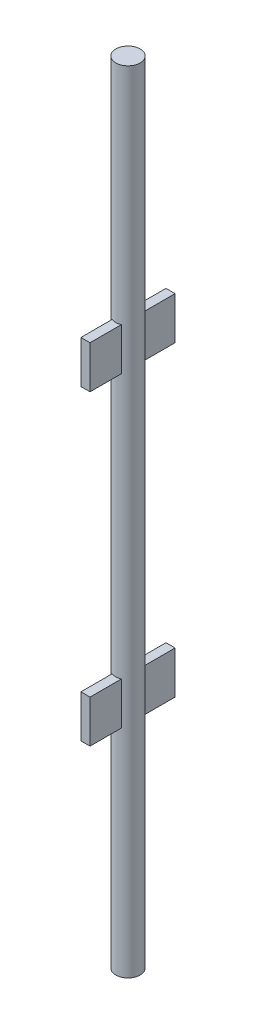
ISO-10303-21;
HEADER;
FILE_DESCRIPTION(('STEP AP214'),'2;1');
FILE_NAME('part.step','',(''),(''),'','','');
FILE_SCHEMA(('AUTOMOTIVE_DESIGN { 1 0 10303 214 1 1 1 1 }'));
ENDSEC;
DATA;
#1=APPLICATION_CONTEXT('core data for automotive mechanical design processes');
#2=APPLICATION_PROTOCOL_DEFINITION('international standard','automotive_design',2000,#1);
#3=PRODUCT_CONTEXT('',#1,'mechanical');
#4=PRODUCT('Part','Part','',(#3));
#5=PRODUCT_RELATED_PRODUCT_CATEGORY('part','',(#4));
#6=PRODUCT_DEFINITION_FORMATION('','',#4);
#7=PRODUCT_DEFINITION_CONTEXT('part definition',#1,'design');
#8=PRODUCT_DEFINITION('design','',#6,#7);
#9=PRODUCT_DEFINITION_SHAPE('','',#8);
#10=(LENGTH_UNIT() NAMED_UNIT(*) SI_UNIT(.MILLI.,.METRE.));
#11=(NAMED_UNIT(*) PLANE_ANGLE_UNIT() SI_UNIT($,.RADIAN.));
#12=(NAMED_UNIT(*) SI_UNIT($,.STERADIAN.) SOLID_ANGLE_UNIT());
#13=UNCERTAINTY_MEASURE_WITH_UNIT(LENGTH_MEASURE(1.E-05),#10,'distance_accuracy_value','');
#14=(GEOMETRIC_REPRESENTATION_CONTEXT(3) GLOBAL_UNCERTAINTY_ASSIGNED_CONTEXT((#13)) GLOBAL_UNIT_ASSIGNED_CONTEXT((#10,
#11,#12)) REPRESENTATION_CONTEXT('',''));
#15=CARTESIAN_POINT('',(0.,0.,0.));
#16=DIRECTION('',(0.,0.,1.));
#17=DIRECTION('',(1.,0.,0.));
#18=AXIS2_PLACEMENT_3D('',#15,#16,#17);
#19=CARTESIAN_POINT('',(0.,1300.,0.));
#20=DIRECTION('',(0.,-1.,0.));
#21=DIRECTION('',(0.,0.,-1.));
#22=AXIS2_PLACEMENT_3D('',#19,#20,#21);
#23=CYLINDRICAL_SURFACE('',#22,20.);
#24=DIRECTION('',(0.,-1.,0.));
#25=VECTOR('',#24,1.);
#26=CARTESIAN_POINT('',(-7.49999999999995,1300.,-18.5404962177392));
#27=LINE('',#26,#25);
#28=CARTESIAN_POINT('',(-7.49999999999995,860.,-18.5404962177392));
#29=VERTEX_POINT('',#28);
#30=CARTESIAN_POINT('',(-7.49999999999995,930.,-18.5404962177392));
#31=VERTEX_POINT('',#30);
#32=EDGE_CURVE('E244',#29,#31,#27,.F.);
#33=ORIENTED_EDGE('',*,*,#32,.F.);
#34=CARTESIAN_POINT('',(0.,860.,0.));
#35=DIRECTION('',(0.,1.,0.));
#36=DIRECTION('',(0.,0.,1.));
#37=AXIS2_PLACEMENT_3D('',#34,#35,#36);
#38=CIRCLE('',#37,20.);
#39=CARTESIAN_POINT('',(7.49999999999995,860.,-18.5404962177392));
#40=VERTEX_POINT('',#39);
#41=EDGE_CURVE('E241',#40,#29,#38,.T.);
#42=ORIENTED_EDGE('',*,*,#41,.F.);
#43=DIRECTION('',(0.,-1.,0.));
#44=VECTOR('',#43,1.);
#45=CARTESIAN_POINT('',(7.49999999999995,1300.,-18.5404962177392));
#46=LINE('',#45,#44);
#47=CARTESIAN_POINT('',(7.50000000000004,930.,-18.5404962177391));
#48=VERTEX_POINT('',#47);
#49=EDGE_CURVE('E237',#48,#40,#46,.T.);
#50=ORIENTED_EDGE('',*,*,#49,.F.);
#51=CARTESIAN_POINT('',(0.,930.,0.));
#52=DIRECTION('',(0.,-1.,0.));
#53=DIRECTION('',(0.,0.,-1.));
#54=AXIS2_PLACEMENT_3D('',#51,#52,#53);
#55=CIRCLE('',#54,20.);
#56=EDGE_CURVE('E234',#31,#48,#55,.T.);
#57=ORIENTED_EDGE('',*,*,#56,.F.);
#58=EDGE_LOOP('',(#33,#42,#50,#57));
#59=FACE_BOUND('',#58,.T.);
#60=DIRECTION('',(0.,-1.,0.));
#61=VECTOR('',#60,1.);
#62=CARTESIAN_POINT('',(7.49999999999982,1300.,18.5404962177392));
#63=LINE('',#62,#61);
#64=CARTESIAN_POINT('',(7.49999999999993,355.,18.5404962177392));
#65=VERTEX_POINT('',#64);
#66=CARTESIAN_POINT('',(7.49999999999992,425.,18.5404962177392));
#67=VERTEX_POINT('',#66);
#68=EDGE_CURVE('E224',#65,#67,#63,.F.);
#69=ORIENTED_EDGE('',*,*,#68,.F.);
#70=CARTESIAN_POINT('',(0.,355.,0.));
#71=DIRECTION('',(0.,1.,0.));
#72=DIRECTION('',(0.,0.,1.));
#73=AXIS2_PLACEMENT_3D('',#70,#71,#72);
#74=CIRCLE('',#73,20.);
#75=CARTESIAN_POINT('',(-7.50000000000007,355.,18.5404962177391));
#76=VERTEX_POINT('',#75);
#77=EDGE_CURVE('E212',#76,#65,#74,.T.);
#78=ORIENTED_EDGE('',*,*,#77,.F.);
#79=DIRECTION('',(0.,-1.,0.));
#80=VECTOR('',#79,1.);
#81=CARTESIAN_POINT('',(-7.50000000000019,1300.,18.5404962177391));
#82=LINE('',#81,#80);
#83=CARTESIAN_POINT('',(-7.50000000000019,425.,18.5404962177391));
#84=VERTEX_POINT('',#83);
#85=EDGE_CURVE('E217',#84,#76,#82,.T.);
#86=ORIENTED_EDGE('',*,*,#85,.F.);
#87=CARTESIAN_POINT('',(0.,425.,0.));
#88=DIRECTION('',(0.,-1.,0.));
#89=DIRECTION('',(0.,0.,-1.));
#90=AXIS2_PLACEMENT_3D('',#87,#88,#89);
#91=CIRCLE('',#90,20.);
#92=EDGE_CURVE('E221',#67,#84,#91,.T.);
#93=ORIENTED_EDGE('',*,*,#92,.F.);
#94=EDGE_LOOP('',(#69,#78,#86,#93));
#95=FACE_BOUND('',#94,.T.);
#96=CARTESIAN_POINT('',(0.,1300.,0.));
#97=DIRECTION('',(0.,1.,0.));
#98=DIRECTION('',(0.,0.,1.));
#99=AXIS2_PLACEMENT_3D('',#96,#97,#98);
#100=CIRCLE('',#99,20.);
#101=CARTESIAN_POINT('',(0.,1300.,20.));
#102=VERTEX_POINT('',#101);
#103=EDGE_CURVE('E209',#102,#102,#100,.T.);
#104=ORIENTED_EDGE('',*,*,#103,.F.);
#105=EDGE_LOOP('',(#104));
#106=FACE_BOUND('',#105,.T.);
#107=CARTESIAN_POINT('',(0.,0.,0.));
#108=DIRECTION('',(0.,1.,0.));
#109=DIRECTION('',(0.,0.,1.));
#110=AXIS2_PLACEMENT_3D('',#107,#108,#109);
#111=CIRCLE('',#110,20.);
#112=CARTESIAN_POINT('',(0.,0.,20.));
#113=VERTEX_POINT('',#112);
#114=EDGE_CURVE('E208',#113,#113,#111,.T.);
#115=ORIENTED_EDGE('',*,*,#114,.T.);
#116=EDGE_LOOP('',(#115));
#117=FACE_BOUND('',#116,.T.);
#118=DIRECTION('',(0.,-1.,0.));
#119=VECTOR('',#118,1.);
#120=CARTESIAN_POINT('',(7.49999999999982,1300.,-18.5404962177392));
#121=LINE('',#120,#119);
#122=CARTESIAN_POINT('',(7.49999999999992,425.,-18.5404962177392));
#123=VERTEX_POINT('',#122);
#124=CARTESIAN_POINT('',(7.49999999999993,355.,-18.5404962177392));
#125=VERTEX_POINT('',#124);
#126=EDGE_CURVE('E231',#123,#125,#121,.T.);
#127=ORIENTED_EDGE('',*,*,#126,.F.);
#128=CARTESIAN_POINT('',(-7.50000000000019,425.,-18.5404962177391));
#129=VERTEX_POINT('',#128);
#130=EDGE_CURVE('E225',#129,#123,#91,.T.);
#131=ORIENTED_EDGE('',*,*,#130,.F.);
#132=DIRECTION('',(0.,-1.,0.));
#133=VECTOR('',#132,1.);
#134=CARTESIAN_POINT('',(-7.50000000000019,1300.,-18.5404962177391));
#135=LINE('',#134,#133);
#136=CARTESIAN_POINT('',(-7.50000000000007,355.,-18.5404962177391));
#137=VERTEX_POINT('',#136);
#138=EDGE_CURVE('E228',#137,#129,#135,.F.);
#139=ORIENTED_EDGE('',*,*,#138,.F.);
#140=EDGE_CURVE('E218',#125,#137,#74,.T.);
#141=ORIENTED_EDGE('',*,*,#140,.F.);
#142=EDGE_LOOP('',(#127,#131,#139,#141));
#143=FACE_BOUND('',#142,.T.);
#144=DIRECTION('',(0.,-1.,0.));
#145=VECTOR('',#144,1.);
#146=CARTESIAN_POINT('',(-7.49999999999995,1300.,18.5404962177392));
#147=LINE('',#146,#145);
#148=CARTESIAN_POINT('',(-7.49999999999995,930.,18.5404962177392));
#149=VERTEX_POINT('',#148);
#150=CARTESIAN_POINT('',(-7.49999999999995,860.,18.5404962177392));
#151=VERTEX_POINT('',#150);
#152=EDGE_CURVE('E11',#149,#151,#147,.T.);
#153=ORIENTED_EDGE('',*,*,#152,.F.);
#154=CARTESIAN_POINT('',(7.50000000000004,930.,18.5404962177391));
#155=VERTEX_POINT('',#154);
#156=EDGE_CURVE('E238',#155,#149,#55,.T.);
#157=ORIENTED_EDGE('',*,*,#156,.F.);
#158=DIRECTION('',(0.,-1.,0.));
#159=VECTOR('',#158,1.);
#160=CARTESIAN_POINT('',(7.49999999999995,1300.,18.5404962177392));
#161=LINE('',#160,#159);
#162=CARTESIAN_POINT('',(7.49999999999995,860.,18.5404962177392));
#163=VERTEX_POINT('',#162);
#164=EDGE_CURVE('E53',#163,#155,#161,.F.);
#165=ORIENTED_EDGE('',*,*,#164,.F.);
#166=EDGE_CURVE('E43',#151,#163,#38,.T.);
#167=ORIENTED_EDGE('',*,*,#166,.F.);
#168=EDGE_LOOP('',(#153,#157,#165,#167));
#169=FACE_BOUND('',#168,.T.);
#170=ADVANCED_FACE('F36',(#59,#95,#106,#117,#143,#169),#23,.T.);
#171=CARTESIAN_POINT('',(0.,1300.,0.));
#172=DIRECTION('',(0.,1.,0.));
#173=DIRECTION('',(0.,0.,1.));
#174=AXIS2_PLACEMENT_3D('',#171,#172,#173);
#175=PLANE('',#174);
#176=ORIENTED_EDGE('',*,*,#103,.T.);
#177=EDGE_LOOP('',(#176));
#178=FACE_BOUND('',#177,.T.);
#179=ADVANCED_FACE('F302',(#178),#175,.T.);
#180=CARTESIAN_POINT('',(0.,0.,0.));
#181=DIRECTION('',(0.,1.,0.));
#182=DIRECTION('',(0.,0.,1.));
#183=AXIS2_PLACEMENT_3D('',#180,#181,#182);
#184=PLANE('',#183);
#185=ORIENTED_EDGE('',*,*,#114,.F.);
#186=EDGE_LOOP('',(#185));
#187=FACE_BOUND('',#186,.T.);
#188=ADVANCED_FACE('F306',(#187),#184,.F.);
#189=CARTESIAN_POINT('',(0.,0.,70.));
#190=DIRECTION('',(0.,0.,-1.));
#191=DIRECTION('',(-1.,0.,0.));
#192=AXIS2_PLACEMENT_3D('',#189,#190,#191);
#193=PLANE('',#192);
#194=DIRECTION('',(0.,1.,0.));
#195=VECTOR('',#194,1.);
#196=CARTESIAN_POINT('',(7.49999999999992,425.,70.));
#197=LINE('',#196,#195);
#198=CARTESIAN_POINT('',(7.49999999999993,355.,70.));
#199=VERTEX_POINT('',#198);
#200=CARTESIAN_POINT('',(7.49999999999992,425.,70.));
#201=VERTEX_POINT('',#200);
#202=EDGE_CURVE('E175',#199,#201,#197,.T.);
#203=ORIENTED_EDGE('',*,*,#202,.T.);
#204=DIRECTION('',(-1.,0.,0.));
#205=VECTOR('',#204,1.);
#206=CARTESIAN_POINT('',(7.49999999999992,425.,70.));
#207=LINE('',#206,#205);
#208=CARTESIAN_POINT('',(-7.50000000000008,425.,70.));
#209=VERTEX_POINT('',#208);
#210=EDGE_CURVE('E178',#201,#209,#207,.T.);
#211=ORIENTED_EDGE('',*,*,#210,.T.);
#212=DIRECTION('',(0.,-1.,0.));
#213=VECTOR('',#212,1.);
#214=CARTESIAN_POINT('',(-7.50000000000008,425.,70.));
#215=LINE('',#214,#213);
#216=CARTESIAN_POINT('',(-7.50000000000007,355.,70.));
#217=VERTEX_POINT('',#216);
#218=EDGE_CURVE('E181',#209,#217,#215,.T.);
#219=ORIENTED_EDGE('',*,*,#218,.T.);
#220=DIRECTION('',(1.,0.,0.));
#221=VECTOR('',#220,1.);
#222=CARTESIAN_POINT('',(7.49999999999993,355.,70.));
#223=LINE('',#222,#221);
#224=EDGE_CURVE('E183',#217,#199,#223,.T.);
#225=ORIENTED_EDGE('',*,*,#224,.T.);
#226=EDGE_LOOP('',(#203,#211,#219,#225));
#227=FACE_BOUND('',#226,.T.);
#228=ADVANCED_FACE('F312',(#227),#193,.F.);
#229=CARTESIAN_POINT('',(7.49999999999993,355.,70.));
#230=DIRECTION('',(0.,1.,0.));
#231=DIRECTION('',(0.,0.,1.));
#232=AXIS2_PLACEMENT_3D('',#229,#230,#231);
#233=PLANE('',#232);
#234=DIRECTION('',(0.,0.,-1.));
#235=VECTOR('',#234,1.);
#236=CARTESIAN_POINT('',(-7.50000000000007,355.,70.));
#237=LINE('',#236,#235);
#238=EDGE_CURVE('E197',#217,#76,#237,.T.);
#239=ORIENTED_EDGE('',*,*,#238,.T.);
#240=ORIENTED_EDGE('',*,*,#77,.T.);
#241=DIRECTION('',(0.,0.,-1.));
#242=VECTOR('',#241,1.);
#243=CARTESIAN_POINT('',(7.49999999999993,355.,70.));
#244=LINE('',#243,#242);
#245=EDGE_CURVE('E193',#199,#65,#244,.T.);
#246=ORIENTED_EDGE('',*,*,#245,.F.);
#247=ORIENTED_EDGE('',*,*,#224,.F.);
#248=EDGE_LOOP('',(#239,#240,#246,#247));
#249=FACE_BOUND('',#248,.T.);
#250=ADVANCED_FACE('F331',(#249),#233,.F.);
#251=CARTESIAN_POINT('',(-7.50000000000008,425.,70.));
#252=DIRECTION('',(1.,0.,0.));
#253=DIRECTION('',(0.,1.,0.));
#254=AXIS2_PLACEMENT_3D('',#251,#252,#253);
#255=PLANE('',#254);
#256=DIRECTION('',(0.,0.,-1.));
#257=VECTOR('',#256,1.);
#258=CARTESIAN_POINT('',(-7.50000000000008,425.,70.));
#259=LINE('',#258,#257);
#260=EDGE_CURVE('E201',#209,#84,#259,.T.);
#261=ORIENTED_EDGE('',*,*,#260,.T.);
#262=ORIENTED_EDGE('',*,*,#85,.T.);
#263=ORIENTED_EDGE('',*,*,#238,.F.);
#264=ORIENTED_EDGE('',*,*,#218,.F.);
#265=EDGE_LOOP('',(#261,#262,#263,#264));
#266=FACE_BOUND('',#265,.T.);
#267=ADVANCED_FACE('F328',(#266),#255,.F.);
#268=CARTESIAN_POINT('',(7.49999999999992,425.,70.));
#269=DIRECTION('',(0.,-1.,0.));
#270=DIRECTION('',(0.,0.,-1.));
#271=AXIS2_PLACEMENT_3D('',#268,#269,#270);
#272=PLANE('',#271);
#273=DIRECTION('',(0.,0.,-1.));
#274=VECTOR('',#273,1.);
#275=CARTESIAN_POINT('',(7.49999999999992,425.,70.));
#276=LINE('',#275,#274);
#277=EDGE_CURVE('E205',#201,#67,#276,.T.);
#278=ORIENTED_EDGE('',*,*,#277,.T.);
#279=ORIENTED_EDGE('',*,*,#92,.T.);
#280=ORIENTED_EDGE('',*,*,#260,.F.);
#281=ORIENTED_EDGE('',*,*,#210,.F.);
#282=EDGE_LOOP('',(#278,#279,#280,#281));
#283=FACE_BOUND('',#282,.T.);
#284=ADVANCED_FACE('F327',(#283),#272,.F.);
#285=CARTESIAN_POINT('',(7.49999999999992,425.,70.));
#286=DIRECTION('',(-1.,0.,0.));
#287=DIRECTION('',(0.,-1.,0.));
#288=AXIS2_PLACEMENT_3D('',#285,#286,#287);
#289=PLANE('',#288);
#290=ORIENTED_EDGE('',*,*,#245,.T.);
#291=ORIENTED_EDGE('',*,*,#68,.T.);
#292=ORIENTED_EDGE('',*,*,#277,.F.);
#293=ORIENTED_EDGE('',*,*,#202,.F.);
#294=EDGE_LOOP('',(#290,#291,#292,#293));
#295=FACE_BOUND('',#294,.T.);
#296=ADVANCED_FACE('F319',(#295),#289,.F.);
#297=CARTESIAN_POINT('',(7.49999999999992,425.,-70.));
#298=VERTEX_POINT('',#297);
#299=EDGE_CURVE('E204',#123,#298,#276,.T.);
#300=ORIENTED_EDGE('',*,*,#299,.F.);
#301=ORIENTED_EDGE('',*,*,#126,.T.);
#302=CARTESIAN_POINT('',(7.49999999999993,355.,-70.));
#303=VERTEX_POINT('',#302);
#304=EDGE_CURVE('E184',#125,#303,#244,.T.);
#305=ORIENTED_EDGE('',*,*,#304,.T.);
#306=DIRECTION('',(0.,1.,0.));
#307=VECTOR('',#306,1.);
#308=CARTESIAN_POINT('',(7.49999999999992,425.,-70.));
#309=LINE('',#308,#307);
#310=EDGE_CURVE('E166',#303,#298,#309,.T.);
#311=ORIENTED_EDGE('',*,*,#310,.T.);
#312=EDGE_LOOP('',(#300,#301,#305,#311));
#313=FACE_BOUND('',#312,.T.);
#314=ADVANCED_FACE('F315',(#313),#289,.F.);
#315=CARTESIAN_POINT('',(-7.50000000000007,355.,-70.));
#316=VERTEX_POINT('',#315);
#317=EDGE_CURVE('E196',#137,#316,#237,.T.);
#318=ORIENTED_EDGE('',*,*,#317,.F.);
#319=ORIENTED_EDGE('',*,*,#138,.T.);
#320=CARTESIAN_POINT('',(-7.50000000000008,425.,-70.));
#321=VERTEX_POINT('',#320);
#322=EDGE_CURVE('E200',#129,#321,#259,.T.);
#323=ORIENTED_EDGE('',*,*,#322,.T.);
#324=DIRECTION('',(0.,-1.,0.));
#325=VECTOR('',#324,1.);
#326=CARTESIAN_POINT('',(-7.50000000000008,425.,-70.));
#327=LINE('',#326,#325);
#328=EDGE_CURVE('E188',#321,#316,#327,.T.);
#329=ORIENTED_EDGE('',*,*,#328,.T.);
#330=EDGE_LOOP('',(#318,#319,#323,#329));
#331=FACE_BOUND('',#330,.T.);
#332=ADVANCED_FACE('F318',(#331),#255,.F.);
#333=ORIENTED_EDGE('',*,*,#304,.F.);
#334=ORIENTED_EDGE('',*,*,#140,.T.);
#335=ORIENTED_EDGE('',*,*,#317,.T.);
#336=DIRECTION('',(1.,0.,0.));
#337=VECTOR('',#336,1.);
#338=CARTESIAN_POINT('',(7.49999999999993,355.,-70.));
#339=LINE('',#338,#337);
#340=EDGE_CURVE('E179',#316,#303,#339,.T.);
#341=ORIENTED_EDGE('',*,*,#340,.T.);
#342=EDGE_LOOP('',(#333,#334,#335,#341));
#343=FACE_BOUND('',#342,.T.);
#344=ADVANCED_FACE('F325',(#343),#233,.F.);
#345=ORIENTED_EDGE('',*,*,#322,.F.);
#346=ORIENTED_EDGE('',*,*,#130,.T.);
#347=ORIENTED_EDGE('',*,*,#299,.T.);
#348=DIRECTION('',(-1.,0.,0.));
#349=VECTOR('',#348,1.);
#350=CARTESIAN_POINT('',(7.49999999999992,425.,-70.));
#351=LINE('',#350,#349);
#352=EDGE_CURVE('E170',#298,#321,#351,.T.);
#353=ORIENTED_EDGE('',*,*,#352,.T.);
#354=EDGE_LOOP('',(#345,#346,#347,#353));
#355=FACE_BOUND('',#354,.T.);
#356=ADVANCED_FACE('F321',(#355),#272,.F.);
#357=CARTESIAN_POINT('',(0.,0.,-70.));
#358=DIRECTION('',(0.,0.,-1.));
#359=DIRECTION('',(-1.,0.,0.));
#360=AXIS2_PLACEMENT_3D('',#357,#358,#359);
#361=PLANE('',#360);
#362=ORIENTED_EDGE('',*,*,#310,.F.);
#363=ORIENTED_EDGE('',*,*,#340,.F.);
#364=ORIENTED_EDGE('',*,*,#328,.F.);
#365=ORIENTED_EDGE('',*,*,#352,.F.);
#366=EDGE_LOOP('',(#362,#363,#364,#365));
#367=FACE_BOUND('',#366,.T.);
#368=ADVANCED_FACE('F324',(#367),#361,.T.);
#369=CARTESIAN_POINT('',(0.,0.,-70.));
#370=DIRECTION('',(0.,0.,1.));
#371=DIRECTION('',(1.,0.,0.));
#372=AXIS2_PLACEMENT_3D('',#369,#370,#371);
#373=PLANE('',#372);
#374=DIRECTION('',(0.,-1.,0.));
#375=VECTOR('',#374,1.);
#376=CARTESIAN_POINT('',(-7.49999999999995,860.,-70.));
#377=LINE('',#376,#375);
#378=CARTESIAN_POINT('',(-7.49999999999995,930.,-70.));
#379=VERTEX_POINT('',#378);
#380=CARTESIAN_POINT('',(-7.49999999999995,860.,-70.));
#381=VERTEX_POINT('',#380);
#382=EDGE_CURVE('E268',#379,#381,#377,.T.);
#383=ORIENTED_EDGE('',*,*,#382,.F.);
#384=DIRECTION('',(-1.,0.,0.));
#385=VECTOR('',#384,1.);
#386=CARTESIAN_POINT('',(7.50000000000004,930.,-70.));
#387=LINE('',#386,#385);
#388=CARTESIAN_POINT('',(7.50000000000004,930.,-70.));
#389=VERTEX_POINT('',#388);
#390=EDGE_CURVE('E163',#389,#379,#387,.T.);
#391=ORIENTED_EDGE('',*,*,#390,.F.);
#392=DIRECTION('',(0.,1.,0.));
#393=VECTOR('',#392,1.);
#394=CARTESIAN_POINT('',(7.50000000000006,860.,-70.));
#395=LINE('',#394,#393);
#396=CARTESIAN_POINT('',(7.50000000000006,860.,-70.));
#397=VERTEX_POINT('',#396);
#398=EDGE_CURVE('E272',#397,#389,#395,.T.);
#399=ORIENTED_EDGE('',*,*,#398,.F.);
#400=DIRECTION('',(1.,0.,0.));
#401=VECTOR('',#400,1.);
#402=CARTESIAN_POINT('',(7.50000000000006,860.,-70.));
#403=LINE('',#402,#401);
#404=EDGE_CURVE('E271',#381,#397,#403,.T.);
#405=ORIENTED_EDGE('',*,*,#404,.F.);
#406=EDGE_LOOP('',(#383,#391,#399,#405));
#407=FACE_BOUND('',#406,.T.);
#408=ADVANCED_FACE('F283',(#407),#373,.F.);
#409=CARTESIAN_POINT('',(7.50000000000004,930.,70.));
#410=DIRECTION('',(0.,-1.,0.));
#411=DIRECTION('',(0.,0.,-1.));
#412=AXIS2_PLACEMENT_3D('',#409,#410,#411);
#413=PLANE('',#412);
#414=DIRECTION('',(0.,0.,-1.));
#415=VECTOR('',#414,1.);
#416=CARTESIAN_POINT('',(-7.49999999999995,930.,70.));
#417=LINE('',#416,#415);
#418=EDGE_CURVE('E255',#31,#379,#417,.T.);
#419=ORIENTED_EDGE('',*,*,#418,.F.);
#420=ORIENTED_EDGE('',*,*,#56,.T.);
#421=DIRECTION('',(0.,0.,-1.));
#422=VECTOR('',#421,1.);
#423=CARTESIAN_POINT('',(7.50000000000004,930.,70.));
#424=LINE('',#423,#422);
#425=EDGE_CURVE('E254',#48,#389,#424,.T.);
#426=ORIENTED_EDGE('',*,*,#425,.T.);
#427=ORIENTED_EDGE('',*,*,#390,.T.);
#428=EDGE_LOOP('',(#419,#420,#426,#427));
#429=FACE_BOUND('',#428,.T.);
#430=ADVANCED_FACE('F280',(#429),#413,.F.);
#431=CARTESIAN_POINT('',(7.50000000000006,860.,70.));
#432=DIRECTION('',(-1.,0.,0.));
#433=DIRECTION('',(0.,-1.,0.));
#434=AXIS2_PLACEMENT_3D('',#431,#432,#433);
#435=PLANE('',#434);
#436=ORIENTED_EDGE('',*,*,#425,.F.);
#437=ORIENTED_EDGE('',*,*,#49,.T.);
#438=DIRECTION('',(0.,0.,-1.));
#439=VECTOR('',#438,1.);
#440=CARTESIAN_POINT('',(7.50000000000006,860.,70.));
#441=LINE('',#440,#439);
#442=EDGE_CURVE('E259',#40,#397,#441,.T.);
#443=ORIENTED_EDGE('',*,*,#442,.T.);
#444=ORIENTED_EDGE('',*,*,#398,.T.);
#445=EDGE_LOOP('',(#436,#437,#443,#444));
#446=FACE_BOUND('',#445,.T.);
#447=ADVANCED_FACE('F292',(#446),#435,.F.);
#448=CARTESIAN_POINT('',(7.50000000000006,860.,70.));
#449=DIRECTION('',(0.,1.,0.));
#450=DIRECTION('',(0.,0.,1.));
#451=AXIS2_PLACEMENT_3D('',#448,#449,#450);
#452=PLANE('',#451);
#453=ORIENTED_EDGE('',*,*,#442,.F.);
#454=ORIENTED_EDGE('',*,*,#41,.T.);
#455=DIRECTION('',(0.,0.,-1.));
#456=VECTOR('',#455,1.);
#457=CARTESIAN_POINT('',(-7.49999999999995,860.,70.));
#458=LINE('',#457,#456);
#459=EDGE_CURVE('E167',#29,#381,#458,.T.);
#460=ORIENTED_EDGE('',*,*,#459,.T.);
#461=ORIENTED_EDGE('',*,*,#404,.T.);
#462=EDGE_LOOP('',(#453,#454,#460,#461));
#463=FACE_BOUND('',#462,.T.);
#464=ADVANCED_FACE('F290',(#463),#452,.F.);
#465=CARTESIAN_POINT('',(-7.49999999999995,860.,70.));
#466=DIRECTION('',(1.,0.,0.));
#467=DIRECTION('',(0.,0.,-1.));
#468=AXIS2_PLACEMENT_3D('',#465,#466,#467);
#469=PLANE('',#468);
#470=ORIENTED_EDGE('',*,*,#459,.F.);
#471=ORIENTED_EDGE('',*,*,#32,.T.);
#472=ORIENTED_EDGE('',*,*,#418,.T.);
#473=ORIENTED_EDGE('',*,*,#382,.T.);
#474=EDGE_LOOP('',(#470,#471,#472,#473));
#475=FACE_BOUND('',#474,.T.);
#476=ADVANCED_FACE('F286',(#475),#469,.F.);
#477=CARTESIAN_POINT('',(-7.49999999999995,930.,70.));
#478=VERTEX_POINT('',#477);
#479=EDGE_CURVE('E252',#478,#149,#417,.T.);
#480=ORIENTED_EDGE('',*,*,#479,.T.);
#481=ORIENTED_EDGE('',*,*,#152,.T.);
#482=CARTESIAN_POINT('',(-7.49999999999995,860.,70.));
#483=VERTEX_POINT('',#482);
#484=EDGE_CURVE('E148',#483,#151,#458,.T.);
#485=ORIENTED_EDGE('',*,*,#484,.F.);
#486=DIRECTION('',(0.,-1.,0.));
#487=VECTOR('',#486,1.);
#488=CARTESIAN_POINT('',(-7.49999999999995,860.,70.));
#489=LINE('',#488,#487);
#490=EDGE_CURVE('E154',#478,#483,#489,.T.);
#491=ORIENTED_EDGE('',*,*,#490,.F.);
#492=EDGE_LOOP('',(#480,#481,#485,#491));
#493=FACE_BOUND('',#492,.T.);
#494=ADVANCED_FACE('F165',(#493),#469,.F.);
#495=CARTESIAN_POINT('',(7.50000000000006,860.,70.));
#496=VERTEX_POINT('',#495);
#497=EDGE_CURVE('E150',#496,#163,#441,.T.);
#498=ORIENTED_EDGE('',*,*,#497,.T.);
#499=ORIENTED_EDGE('',*,*,#164,.T.);
#500=CARTESIAN_POINT('',(7.50000000000004,930.,70.));
#501=VERTEX_POINT('',#500);
#502=EDGE_CURVE('E253',#501,#155,#424,.T.);
#503=ORIENTED_EDGE('',*,*,#502,.F.);
#504=DIRECTION('',(0.,1.,0.));
#505=VECTOR('',#504,1.);
#506=CARTESIAN_POINT('',(7.50000000000006,860.,70.));
#507=LINE('',#506,#505);
#508=EDGE_CURVE('E153',#496,#501,#507,.T.);
#509=ORIENTED_EDGE('',*,*,#508,.F.);
#510=EDGE_LOOP('',(#498,#499,#503,#509));
#511=FACE_BOUND('',#510,.T.);
#512=ADVANCED_FACE('F264',(#511),#435,.F.);
#513=ORIENTED_EDGE('',*,*,#502,.T.);
#514=ORIENTED_EDGE('',*,*,#156,.T.);
#515=ORIENTED_EDGE('',*,*,#479,.F.);
#516=DIRECTION('',(-1.,0.,0.));
#517=VECTOR('',#516,1.);
#518=CARTESIAN_POINT('',(7.50000000000004,930.,70.));
#519=LINE('',#518,#517);
#520=EDGE_CURVE('E159',#501,#478,#519,.T.);
#521=ORIENTED_EDGE('',*,*,#520,.F.);
#522=EDGE_LOOP('',(#513,#514,#515,#521));
#523=FACE_BOUND('',#522,.T.);
#524=ADVANCED_FACE('F251',(#523),#413,.F.);
#525=ORIENTED_EDGE('',*,*,#484,.T.);
#526=ORIENTED_EDGE('',*,*,#166,.T.);
#527=ORIENTED_EDGE('',*,*,#497,.F.);
#528=DIRECTION('',(1.,0.,0.));
#529=VECTOR('',#528,1.);
#530=CARTESIAN_POINT('',(7.50000000000006,860.,70.));
#531=LINE('',#530,#529);
#532=EDGE_CURVE('E144',#483,#496,#531,.T.);
#533=ORIENTED_EDGE('',*,*,#532,.F.);
#534=EDGE_LOOP('',(#525,#526,#527,#533));
#535=FACE_BOUND('',#534,.T.);
#536=ADVANCED_FACE('F146',(#535),#452,.F.);
#537=CARTESIAN_POINT('',(0.,0.,70.));
#538=DIRECTION('',(0.,0.,1.));
#539=DIRECTION('',(1.,0.,0.));
#540=AXIS2_PLACEMENT_3D('',#537,#538,#539);
#541=PLANE('',#540);
#542=ORIENTED_EDGE('',*,*,#490,.T.);
#543=ORIENTED_EDGE('',*,*,#532,.T.);
#544=ORIENTED_EDGE('',*,*,#508,.T.);
#545=ORIENTED_EDGE('',*,*,#520,.T.);
#546=EDGE_LOOP('',(#542,#543,#544,#545));
#547=FACE_BOUND('',#546,.T.);
#548=ADVANCED_FACE('F157',(#547),#541,.T.);
#549=CLOSED_SHELL('',(#170,#179,#188,#228,#250,#267,#284,#296,#314,#332,#344,#356,#368,#408,
#430,#447,#464,#476,#494,#512,#524,#536,#548));
#550=MANIFOLD_SOLID_BREP('B2',#549);
#551=ADVANCED_BREP_SHAPE_REPRESENTATION('',(#18,#550),#14);
#552=SHAPE_DEFINITION_REPRESENTATION(#9,#551);
ENDSEC;
END-ISO-10303-21;
